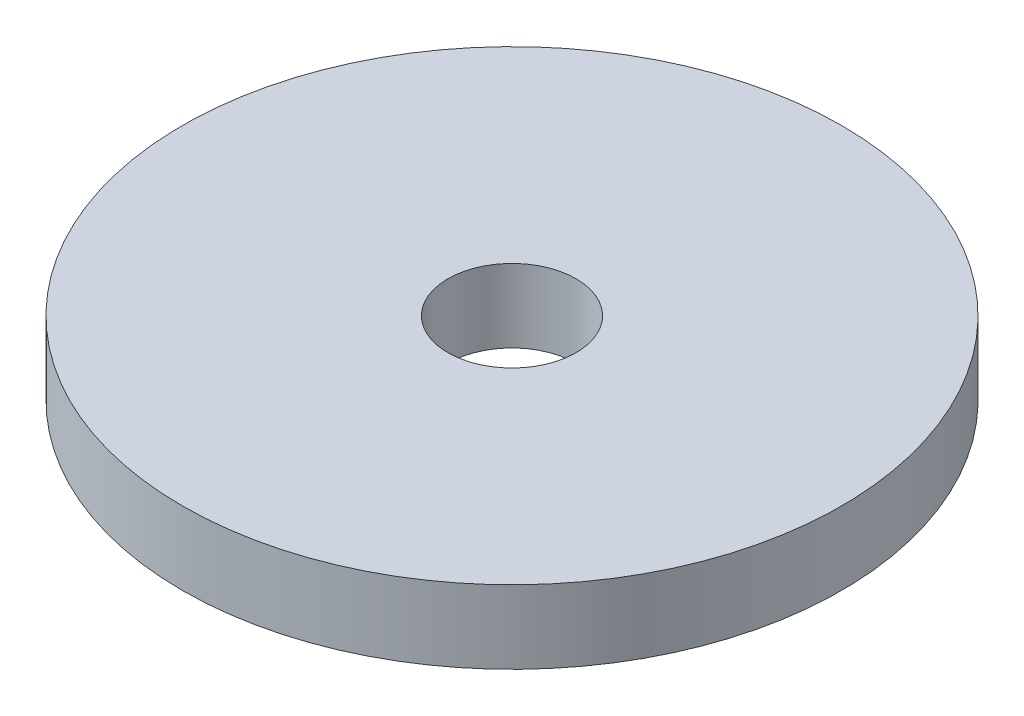
ISO-10303-21;
HEADER;
FILE_DESCRIPTION(('STEP AP214'),'2;1');
FILE_NAME('part.step','',(''),(''),'','','');
FILE_SCHEMA(('AUTOMOTIVE_DESIGN { 1 0 10303 214 1 1 1 1 }'));
ENDSEC;
DATA;
#1=APPLICATION_CONTEXT('core data for automotive mechanical design processes');
#2=APPLICATION_PROTOCOL_DEFINITION('international standard','automotive_design',2000,#1);
#3=PRODUCT_CONTEXT('',#1,'mechanical');
#4=PRODUCT('Part','Part','',(#3));
#5=PRODUCT_RELATED_PRODUCT_CATEGORY('part','',(#4));
#6=PRODUCT_DEFINITION_FORMATION('','',#4);
#7=PRODUCT_DEFINITION_CONTEXT('part definition',#1,'design');
#8=PRODUCT_DEFINITION('design','',#6,#7);
#9=PRODUCT_DEFINITION_SHAPE('','',#8);
#10=(LENGTH_UNIT() NAMED_UNIT(*) SI_UNIT(.MILLI.,.METRE.));
#11=(NAMED_UNIT(*) PLANE_ANGLE_UNIT() SI_UNIT($,.RADIAN.));
#12=(NAMED_UNIT(*) SI_UNIT($,.STERADIAN.) SOLID_ANGLE_UNIT());
#13=UNCERTAINTY_MEASURE_WITH_UNIT(LENGTH_MEASURE(1.E-05),#10,'distance_accuracy_value','');
#14=(GEOMETRIC_REPRESENTATION_CONTEXT(3) GLOBAL_UNCERTAINTY_ASSIGNED_CONTEXT((#13)) GLOBAL_UNIT_ASSIGNED_CONTEXT((#10,
#11,#12)) REPRESENTATION_CONTEXT('',''));
#15=CARTESIAN_POINT('',(0.,0.,0.));
#16=DIRECTION('',(0.,0.,1.));
#17=DIRECTION('',(1.,0.,0.));
#18=AXIS2_PLACEMENT_3D('',#15,#16,#17);
#19=CARTESIAN_POINT('',(5.77407508621427,-3.09545778760964,-29.9298476370313));
#20=DIRECTION('',(0.,1.,0.));
#21=DIRECTION('',(-0.62058919768935,0.,-0.784135860493122));
#22=AXIS2_PLACEMENT_3D('',#19,#20,#21);
#23=PLANE('',#22);
#24=CARTESIAN_POINT('',(5.77407508621427,-3.09545778760964,-29.9298476370313));
#25=DIRECTION('',(0.,-1.,0.));
#26=DIRECTION('',(-0.62058919768935,0.,-0.784135860493122));
#27=AXIS2_PLACEMENT_3D('',#24,#25,#26);
#28=CIRCLE('',#27,1.75);
#29=CARTESIAN_POINT('',(6.86010618217064,-3.09545778760965,-28.5576098811683));
#30=VERTEX_POINT('',#29);
#31=EDGE_CURVE('E63',#30,#30,#28,.T.);
#32=ORIENTED_EDGE('',*,*,#31,.F.);
#33=EDGE_LOOP('',(#32));
#34=FACE_BOUND('',#33,.T.);
#35=CARTESIAN_POINT('',(5.77407508621427,-3.09545778760964,-29.9298476370313));
#36=DIRECTION('',(0.,1.,0.));
#37=DIRECTION('',(0.62058919768935,0.,0.784135860493122));
#38=AXIS2_PLACEMENT_3D('',#35,#36,#37);
#39=CIRCLE('',#38,9.);
#40=CARTESIAN_POINT('',(11.3593778654184,-3.09545778760965,-22.8726248925932));
#41=VERTEX_POINT('',#40);
#42=CARTESIAN_POINT('',(0.188772307010123,-3.09545778760963,-36.9870703814694));
#43=VERTEX_POINT('',#42);
#44=EDGE_CURVE('E10',#41,#43,#39,.T.);
#45=ORIENTED_EDGE('',*,*,#44,.F.);
#46=CARTESIAN_POINT('',(5.77407508621427,-3.09545778760964,-29.9298476370313));
#47=DIRECTION('',(0.,1.,0.));
#48=DIRECTION('',(0.62058919768935,0.,0.784135860493122));
#49=AXIS2_PLACEMENT_3D('',#46,#47,#48);
#50=CIRCLE('',#49,9.);
#51=EDGE_CURVE('E19',#43,#41,#50,.T.);
#52=ORIENTED_EDGE('',*,*,#51,.F.);
#53=EDGE_LOOP('',(#45,#52));
#54=FACE_BOUND('',#53,.T.);
#55=ADVANCED_FACE('F16',(#34,#54),#23,.F.);
#56=CARTESIAN_POINT('',(5.77407508621428,-1.09545778760964,-29.9298476370313));
#57=DIRECTION('',(0.,1.,0.));
#58=DIRECTION('',(-0.62058919768935,0.,-0.784135860493122));
#59=AXIS2_PLACEMENT_3D('',#56,#57,#58);
#60=PLANE('',#59);
#61=CARTESIAN_POINT('',(5.77407508621428,-1.09545778760964,-29.9298476370313));
#62=DIRECTION('',(0.,-1.,0.));
#63=DIRECTION('',(-0.62058919768935,0.,-0.784135860493122));
#64=AXIS2_PLACEMENT_3D('',#61,#62,#63);
#65=CIRCLE('',#64,1.75);
#66=CARTESIAN_POINT('',(6.86010618217064,-1.09545778760965,-28.5576098811683));
#67=VERTEX_POINT('',#66);
#68=EDGE_CURVE('E62',#67,#67,#65,.T.);
#69=ORIENTED_EDGE('',*,*,#68,.T.);
#70=EDGE_LOOP('',(#69));
#71=FACE_BOUND('',#70,.T.);
#72=CARTESIAN_POINT('',(5.77407508621428,-1.09545778760964,-29.9298476370313));
#73=DIRECTION('',(0.,1.,0.));
#74=DIRECTION('',(0.62058919768935,0.,0.784135860493122));
#75=AXIS2_PLACEMENT_3D('',#72,#73,#74);
#76=CIRCLE('',#75,9.);
#77=CARTESIAN_POINT('',(11.3593778654184,-1.09545778760965,-22.8726248925932));
#78=VERTEX_POINT('',#77);
#79=CARTESIAN_POINT('',(0.188772307010125,-1.09545778760963,-36.9870703814694));
#80=VERTEX_POINT('',#79);
#81=EDGE_CURVE('E77',#78,#80,#76,.T.);
#82=ORIENTED_EDGE('',*,*,#81,.T.);
#83=CARTESIAN_POINT('',(5.77407508621428,-1.09545778760964,-29.9298476370313));
#84=DIRECTION('',(0.,1.,0.));
#85=DIRECTION('',(0.62058919768935,0.,0.784135860493122));
#86=AXIS2_PLACEMENT_3D('',#83,#84,#85);
#87=CIRCLE('',#86,9.);
#88=EDGE_CURVE('E85',#80,#78,#87,.T.);
#89=ORIENTED_EDGE('',*,*,#88,.T.);
#90=EDGE_LOOP('',(#82,#89));
#91=FACE_BOUND('',#90,.T.);
#92=ADVANCED_FACE('F68',(#71,#91),#60,.T.);
#93=CARTESIAN_POINT('',(5.77407508621427,-3.09545778760964,-29.9298476370313));
#94=DIRECTION('',(0.,1.,0.));
#95=DIRECTION('',(0.62058919768935,0.,0.784135860493122));
#96=AXIS2_PLACEMENT_3D('',#93,#94,#95);
#97=CYLINDRICAL_SURFACE('',#96,9.);
#98=ORIENTED_EDGE('',*,*,#81,.F.);
#99=ORIENTED_EDGE('',*,*,#88,.F.);
#100=DIRECTION('',(0.,-1.,0.));
#101=VECTOR('',#100,1.);
#102=CARTESIAN_POINT('',(0.188772307010123,-3.09545778760963,-36.9870703814694));
#103=LINE('',#102,#101);
#104=EDGE_CURVE('E81',#80,#43,#103,.T.);
#105=ORIENTED_EDGE('',*,*,#104,.T.);
#106=ORIENTED_EDGE('',*,*,#51,.T.);
#107=ORIENTED_EDGE('',*,*,#44,.T.);
#108=ORIENTED_EDGE('',*,*,#104,.F.);
#109=EDGE_LOOP('',(#98,#99,#105,#106,#107,#108));
#110=FACE_BOUND('',#109,.T.);
#111=ADVANCED_FACE('F94',(#110),#97,.T.);
#112=CARTESIAN_POINT('',(5.77407508621427,-3.09545778760964,-29.9298476370313));
#113=DIRECTION('',(0.,1.,0.));
#114=DIRECTION('',(-0.62058919768935,0.,-0.784135860493122));
#115=AXIS2_PLACEMENT_3D('',#112,#113,#114);
#116=CYLINDRICAL_SURFACE('',#115,1.75);
#117=ORIENTED_EDGE('',*,*,#68,.F.);
#118=DIRECTION('',(0.,-1.,0.));
#119=VECTOR('',#118,1.);
#120=CARTESIAN_POINT('',(6.86010618217064,-3.09545778760965,-28.5576098811683));
#121=LINE('',#120,#119);
#122=EDGE_CURVE('E56',#67,#30,#121,.T.);
#123=ORIENTED_EDGE('',*,*,#122,.T.);
#124=ORIENTED_EDGE('',*,*,#31,.T.);
#125=ORIENTED_EDGE('',*,*,#122,.F.);
#126=EDGE_LOOP('',(#117,#123,#124,#125));
#127=FACE_BOUND('',#126,.T.);
#128=ADVANCED_FACE('F61',(#127),#116,.F.);
#129=CLOSED_SHELL('',(#55,#92,#111,#128));
#130=MANIFOLD_SOLID_BREP('B1',#129);
#131=ADVANCED_BREP_SHAPE_REPRESENTATION('',(#18,#130),#14);
#132=SHAPE_DEFINITION_REPRESENTATION(#9,#131);
ENDSEC;
END-ISO-10303-21;
